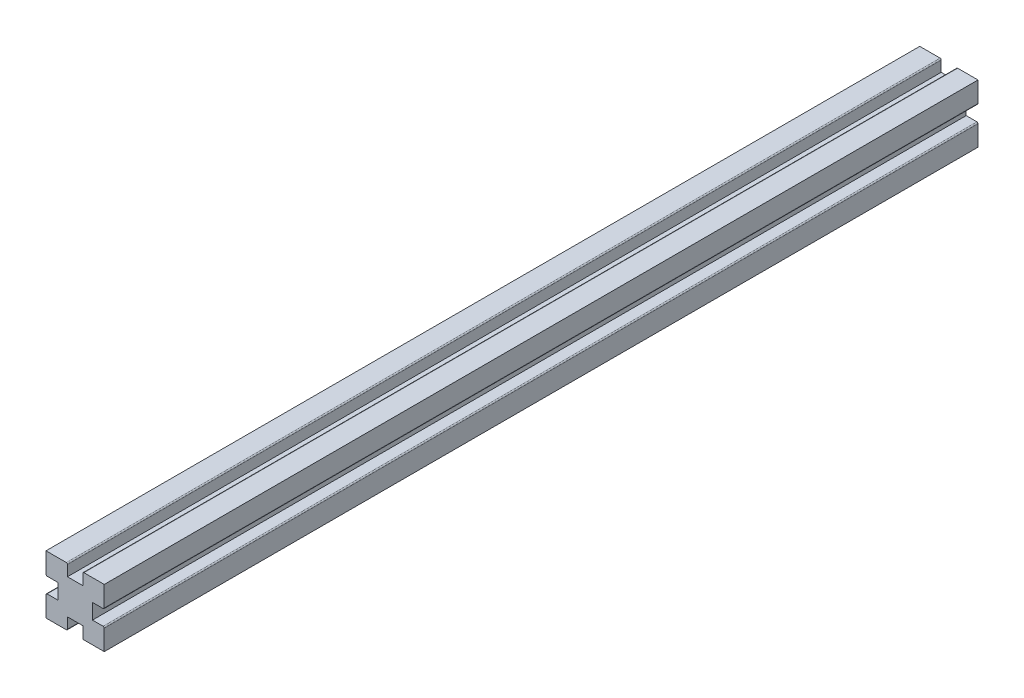
ISO-10303-21;
HEADER;
FILE_DESCRIPTION(('STEP AP214'),'2;1');
FILE_NAME('part.step','',(''),(''),'','','');
FILE_SCHEMA(('AUTOMOTIVE_DESIGN { 1 0 10303 214 1 1 1 1 }'));
ENDSEC;
DATA;
#1=APPLICATION_CONTEXT('core data for automotive mechanical design processes');
#2=APPLICATION_PROTOCOL_DEFINITION('international standard','automotive_design',2000,#1);
#3=PRODUCT_CONTEXT('',#1,'mechanical');
#4=PRODUCT('Part','Part','',(#3));
#5=PRODUCT_RELATED_PRODUCT_CATEGORY('part','',(#4));
#6=PRODUCT_DEFINITION_FORMATION('','',#4);
#7=PRODUCT_DEFINITION_CONTEXT('part definition',#1,'design');
#8=PRODUCT_DEFINITION('design','',#6,#7);
#9=PRODUCT_DEFINITION_SHAPE('','',#8);
#10=(LENGTH_UNIT() NAMED_UNIT(*) SI_UNIT(.MILLI.,.METRE.));
#11=(NAMED_UNIT(*) PLANE_ANGLE_UNIT() SI_UNIT($,.RADIAN.));
#12=(NAMED_UNIT(*) SI_UNIT($,.STERADIAN.) SOLID_ANGLE_UNIT());
#13=UNCERTAINTY_MEASURE_WITH_UNIT(LENGTH_MEASURE(1.E-05),#10,'distance_accuracy_value','');
#14=(GEOMETRIC_REPRESENTATION_CONTEXT(3) GLOBAL_UNCERTAINTY_ASSIGNED_CONTEXT((#13)) GLOBAL_UNIT_ASSIGNED_CONTEXT((#10,
#11,#12)) REPRESENTATION_CONTEXT('',''));
#15=CARTESIAN_POINT('',(0.,0.,0.));
#16=DIRECTION('',(0.,0.,1.));
#17=DIRECTION('',(1.,0.,0.));
#18=AXIS2_PLACEMENT_3D('',#15,#16,#17);
#19=CARTESIAN_POINT('',(-7.56816326530613,0.,381.));
#20=DIRECTION('',(-1.,0.,0.));
#21=DIRECTION('',(0.,-1.,0.));
#22=AXIS2_PLACEMENT_3D('',#19,#20,#21);
#23=PLANE('',#22);
#24=DIRECTION('',(0.,1.,0.));
#25=VECTOR('',#24,1.);
#26=CARTESIAN_POINT('',(-7.56816326530613,0.,0.));
#27=LINE('',#26,#25);
#28=CARTESIAN_POINT('',(-7.56816326530616,-3.33999999999992,0.));
#29=VERTEX_POINT('',#28);
#30=CARTESIAN_POINT('',(-7.56816326530609,3.34000000000008,0.));
#31=VERTEX_POINT('',#30);
#32=EDGE_CURVE('E242',#29,#31,#27,.T.);
#33=ORIENTED_EDGE('',*,*,#32,.F.);
#34=DIRECTION('',(0.,0.,-1.));
#35=VECTOR('',#34,1.);
#36=CARTESIAN_POINT('',(-7.56816326530616,-3.33999999999992,381.));
#37=LINE('',#36,#35);
#38=CARTESIAN_POINT('',(-7.56816326530616,-3.33999999999992,381.));
#39=VERTEX_POINT('',#38);
#40=EDGE_CURVE('E229',#39,#29,#37,.T.);
#41=ORIENTED_EDGE('',*,*,#40,.F.);
#42=DIRECTION('',(0.,1.,0.));
#43=VECTOR('',#42,1.);
#44=CARTESIAN_POINT('',(-7.56816326530613,0.,381.));
#45=LINE('',#44,#43);
#46=CARTESIAN_POINT('',(-7.56816326530609,3.34000000000008,381.));
#47=VERTEX_POINT('',#46);
#48=EDGE_CURVE('E236',#39,#47,#45,.T.);
#49=ORIENTED_EDGE('',*,*,#48,.T.);
#50=DIRECTION('',(0.,0.,-1.));
#51=VECTOR('',#50,1.);
#52=CARTESIAN_POINT('',(-7.56816326530609,3.34000000000008,381.));
#53=LINE('',#52,#51);
#54=EDGE_CURVE('E288',#47,#31,#53,.T.);
#55=ORIENTED_EDGE('',*,*,#54,.T.);
#56=EDGE_LOOP('',(#33,#41,#49,#55));
#57=FACE_BOUND('',#56,.T.);
#58=ADVANCED_FACE('F39',(#57),#23,.T.);
#59=CARTESIAN_POINT('',(0.,-3.34,381.));
#60=DIRECTION('',(0.,1.,0.));
#61=DIRECTION('',(-1.,0.,0.));
#62=AXIS2_PLACEMENT_3D('',#59,#60,#61);
#63=PLANE('',#62);
#64=DIRECTION('',(1.,0.,0.));
#65=VECTOR('',#64,1.);
#66=CARTESIAN_POINT('',(0.,-3.34,0.));
#67=LINE('',#66,#65);
#68=CARTESIAN_POINT('',(-12.2,-3.33999999999987,0.));
#69=VERTEX_POINT('',#68);
#70=EDGE_CURVE('E290',#69,#29,#67,.T.);
#71=ORIENTED_EDGE('',*,*,#70,.F.);
#72=DIRECTION('',(0.,0.,-1.));
#73=VECTOR('',#72,1.);
#74=CARTESIAN_POINT('',(-12.2,-3.33999999999987,381.));
#75=LINE('',#74,#73);
#76=CARTESIAN_POINT('',(-12.2,-3.33999999999987,381.));
#77=VERTEX_POINT('',#76);
#78=EDGE_CURVE('E232',#69,#77,#75,.F.);
#79=ORIENTED_EDGE('',*,*,#78,.T.);
#80=DIRECTION('',(1.,0.,0.));
#81=VECTOR('',#80,1.);
#82=CARTESIAN_POINT('',(0.,-3.34,381.));
#83=LINE('',#82,#81);
#84=EDGE_CURVE('E225',#77,#39,#83,.T.);
#85=ORIENTED_EDGE('',*,*,#84,.T.);
#86=ORIENTED_EDGE('',*,*,#40,.T.);
#87=EDGE_LOOP('',(#71,#79,#85,#86));
#88=FACE_BOUND('',#87,.T.);
#89=ADVANCED_FACE('F228',(#88),#63,.T.);
#90=CARTESIAN_POINT('',(-12.7,0.,381.));
#91=DIRECTION('',(1.,0.,0.));
#92=DIRECTION('',(0.,1.,0.));
#93=AXIS2_PLACEMENT_3D('',#90,#91,#92);
#94=PLANE('',#93);
#95=DIRECTION('',(0.,-1.,0.));
#96=VECTOR('',#95,1.);
#97=CARTESIAN_POINT('',(-12.7,0.,381.));
#98=LINE('',#97,#96);
#99=CARTESIAN_POINT('',(-12.7,-3.83999999999987,381.));
#100=VERTEX_POINT('',#99);
#101=CARTESIAN_POINT('',(-12.7,-12.7,381.));
#102=VERTEX_POINT('',#101);
#103=EDGE_CURVE('E235',#100,#102,#98,.T.);
#104=ORIENTED_EDGE('',*,*,#103,.F.);
#105=DIRECTION('',(0.,0.,-1.));
#106=VECTOR('',#105,1.);
#107=CARTESIAN_POINT('',(-12.7,-3.83999999999987,0.));
#108=LINE('',#107,#106);
#109=CARTESIAN_POINT('',(-12.7,-3.83999999999987,0.));
#110=VERTEX_POINT('',#109);
#111=EDGE_CURVE('E395',#100,#110,#108,.T.);
#112=ORIENTED_EDGE('',*,*,#111,.T.);
#113=DIRECTION('',(0.,-1.,0.));
#114=VECTOR('',#113,1.);
#115=CARTESIAN_POINT('',(-12.7,0.,0.));
#116=LINE('',#115,#114);
#117=CARTESIAN_POINT('',(-12.7,-12.7,0.));
#118=VERTEX_POINT('',#117);
#119=EDGE_CURVE('E292',#110,#118,#116,.T.);
#120=ORIENTED_EDGE('',*,*,#119,.T.);
#121=DIRECTION('',(0.,0.,-1.));
#122=VECTOR('',#121,1.);
#123=CARTESIAN_POINT('',(-12.7,-12.7,381.));
#124=LINE('',#123,#122);
#125=EDGE_CURVE('E244',#102,#118,#124,.T.);
#126=ORIENTED_EDGE('',*,*,#125,.F.);
#127=EDGE_LOOP('',(#104,#112,#120,#126));
#128=FACE_BOUND('',#127,.T.);
#129=ADVANCED_FACE('F512',(#128),#94,.F.);
#130=CARTESIAN_POINT('',(0.,-12.7,381.));
#131=DIRECTION('',(0.,1.,0.));
#132=DIRECTION('',(0.,0.,1.));
#133=AXIS2_PLACEMENT_3D('',#130,#131,#132);
#134=PLANE('',#133);
#135=DIRECTION('',(1.,0.,0.));
#136=VECTOR('',#135,1.);
#137=CARTESIAN_POINT('',(0.,-12.7,0.));
#138=LINE('',#137,#136);
#139=CARTESIAN_POINT('',(-3.83999999999981,-12.7,0.));
#140=VERTEX_POINT('',#139);
#141=EDGE_CURVE('E294',#118,#140,#138,.T.);
#142=ORIENTED_EDGE('',*,*,#141,.T.);
#143=DIRECTION('',(0.,0.,-1.));
#144=VECTOR('',#143,1.);
#145=CARTESIAN_POINT('',(-3.83999999999981,-12.7,381.));
#146=LINE('',#145,#144);
#147=CARTESIAN_POINT('',(-3.83999999999981,-12.7,381.));
#148=VERTEX_POINT('',#147);
#149=EDGE_CURVE('E373',#140,#148,#146,.F.);
#150=ORIENTED_EDGE('',*,*,#149,.T.);
#151=DIRECTION('',(1.,0.,0.));
#152=VECTOR('',#151,1.);
#153=CARTESIAN_POINT('',(0.,-12.7,381.));
#154=LINE('',#153,#152);
#155=EDGE_CURVE('E256',#102,#148,#154,.T.);
#156=ORIENTED_EDGE('',*,*,#155,.F.);
#157=ORIENTED_EDGE('',*,*,#125,.T.);
#158=EDGE_LOOP('',(#142,#150,#156,#157));
#159=FACE_BOUND('',#158,.T.);
#160=ADVANCED_FACE('F519',(#159),#134,.F.);
#161=CARTESIAN_POINT('',(-3.34000000000046,-1.7782157377853E-13,381.));
#162=DIRECTION('',(-1.,0.,0.));
#163=DIRECTION('',(0.,-1.,0.));
#164=AXIS2_PLACEMENT_3D('',#161,#162,#163);
#165=PLANE('',#164);
#166=DIRECTION('',(0.,1.,0.));
#167=VECTOR('',#166,1.);
#168=CARTESIAN_POINT('',(-3.34000000000046,-1.7782157377853E-13,381.));
#169=LINE('',#168,#167);
#170=CARTESIAN_POINT('',(-3.33999999999981,-12.2,381.));
#171=VERTEX_POINT('',#170);
#172=CARTESIAN_POINT('',(-3.34000000000005,-7.5681632653061,381.));
#173=VERTEX_POINT('',#172);
#174=EDGE_CURVE('E259',#171,#173,#169,.T.);
#175=ORIENTED_EDGE('',*,*,#174,.F.);
#176=DIRECTION('',(0.,0.,-1.));
#177=VECTOR('',#176,1.);
#178=CARTESIAN_POINT('',(-3.33999999999981,-12.2,381.));
#179=LINE('',#178,#177);
#180=CARTESIAN_POINT('',(-3.33999999999981,-12.2,0.));
#181=VERTEX_POINT('',#180);
#182=EDGE_CURVE('E243',#171,#181,#179,.T.);
#183=ORIENTED_EDGE('',*,*,#182,.T.);
#184=DIRECTION('',(0.,1.,0.));
#185=VECTOR('',#184,1.);
#186=CARTESIAN_POINT('',(-3.34000000000046,-1.7782157377853E-13,0.));
#187=LINE('',#186,#185);
#188=CARTESIAN_POINT('',(-3.34000000000005,-7.5681632653061,0.));
#189=VERTEX_POINT('',#188);
#190=EDGE_CURVE('E297',#181,#189,#187,.T.);
#191=ORIENTED_EDGE('',*,*,#190,.T.);
#192=DIRECTION('',(0.,0.,-1.));
#193=VECTOR('',#192,1.);
#194=CARTESIAN_POINT('',(-3.34000000000005,-7.5681632653061,381.));
#195=LINE('',#194,#193);
#196=EDGE_CURVE('E350',#173,#189,#195,.T.);
#197=ORIENTED_EDGE('',*,*,#196,.F.);
#198=EDGE_LOOP('',(#175,#183,#191,#197));
#199=FACE_BOUND('',#198,.T.);
#200=ADVANCED_FACE('F515',(#199),#165,.F.);
#201=CARTESIAN_POINT('',(0.,-7.56816326530607,381.));
#202=DIRECTION('',(0.,-1.,0.));
#203=DIRECTION('',(1.,0.,0.));
#204=AXIS2_PLACEMENT_3D('',#201,#202,#203);
#205=PLANE('',#204);
#206=DIRECTION('',(-1.,0.,0.));
#207=VECTOR('',#206,1.);
#208=CARTESIAN_POINT('',(0.,-7.56816326530607,0.));
#209=LINE('',#208,#207);
#210=CARTESIAN_POINT('',(3.34000000000022,-7.56816326530604,0.));
#211=VERTEX_POINT('',#210);
#212=EDGE_CURVE('E300',#211,#189,#209,.T.);
#213=ORIENTED_EDGE('',*,*,#212,.F.);
#214=DIRECTION('',(0.,0.,-1.));
#215=VECTOR('',#214,1.);
#216=CARTESIAN_POINT('',(3.34000000000022,-7.56816326530604,381.));
#217=LINE('',#216,#215);
#218=CARTESIAN_POINT('',(3.34000000000022,-7.56816326530604,381.));
#219=VERTEX_POINT('',#218);
#220=EDGE_CURVE('E347',#219,#211,#217,.T.);
#221=ORIENTED_EDGE('',*,*,#220,.F.);
#222=DIRECTION('',(-1.,0.,0.));
#223=VECTOR('',#222,1.);
#224=CARTESIAN_POINT('',(0.,-7.56816326530607,381.));
#225=LINE('',#224,#223);
#226=EDGE_CURVE('E262',#219,#173,#225,.T.);
#227=ORIENTED_EDGE('',*,*,#226,.T.);
#228=ORIENTED_EDGE('',*,*,#196,.T.);
#229=EDGE_LOOP('',(#213,#221,#227,#228));
#230=FACE_BOUND('',#229,.T.);
#231=ADVANCED_FACE('F518',(#230),#205,.T.);
#232=CARTESIAN_POINT('',(3.34000000000022,0.,381.));
#233=DIRECTION('',(-1.,0.,0.));
#234=DIRECTION('',(0.,-1.,0.));
#235=AXIS2_PLACEMENT_3D('',#232,#233,#234);
#236=PLANE('',#235);
#237=DIRECTION('',(0.,1.,0.));
#238=VECTOR('',#237,1.);
#239=CARTESIAN_POINT('',(3.34000000000022,0.,0.));
#240=LINE('',#239,#238);
#241=CARTESIAN_POINT('',(3.34000000000022,-12.2,0.));
#242=VERTEX_POINT('',#241);
#243=EDGE_CURVE('E303',#242,#211,#240,.T.);
#244=ORIENTED_EDGE('',*,*,#243,.F.);
#245=DIRECTION('',(0.,0.,-1.));
#246=VECTOR('',#245,1.);
#247=CARTESIAN_POINT('',(3.34000000000022,-12.2,381.));
#248=LINE('',#247,#246);
#249=CARTESIAN_POINT('',(3.34000000000022,-12.2,381.));
#250=VERTEX_POINT('',#249);
#251=EDGE_CURVE('E393',#242,#250,#248,.F.);
#252=ORIENTED_EDGE('',*,*,#251,.T.);
#253=DIRECTION('',(0.,1.,0.));
#254=VECTOR('',#253,1.);
#255=CARTESIAN_POINT('',(3.34000000000022,0.,381.));
#256=LINE('',#255,#254);
#257=EDGE_CURVE('E265',#250,#219,#256,.T.);
#258=ORIENTED_EDGE('',*,*,#257,.T.);
#259=ORIENTED_EDGE('',*,*,#220,.T.);
#260=EDGE_LOOP('',(#244,#252,#258,#259));
#261=FACE_BOUND('',#260,.T.);
#262=ADVANCED_FACE('F490',(#261),#236,.T.);
#263=CARTESIAN_POINT('',(3.84000000000022,-12.7,381.));
#264=VERTEX_POINT('',#263);
#265=CARTESIAN_POINT('',(12.7,-12.7,381.));
#266=VERTEX_POINT('',#265);
#267=EDGE_CURVE('E260',#264,#266,#154,.T.);
#268=ORIENTED_EDGE('',*,*,#267,.F.);
#269=DIRECTION('',(0.,0.,-1.));
#270=VECTOR('',#269,1.);
#271=CARTESIAN_POINT('',(3.84000000000022,-12.7,0.));
#272=LINE('',#271,#270);
#273=CARTESIAN_POINT('',(3.84000000000022,-12.7,0.));
#274=VERTEX_POINT('',#273);
#275=EDGE_CURVE('E390',#264,#274,#272,.T.);
#276=ORIENTED_EDGE('',*,*,#275,.T.);
#277=CARTESIAN_POINT('',(12.7,-12.7,0.));
#278=VERTEX_POINT('',#277);
#279=EDGE_CURVE('E298',#274,#278,#138,.T.);
#280=ORIENTED_EDGE('',*,*,#279,.T.);
#281=DIRECTION('',(0.,0.,-1.));
#282=VECTOR('',#281,1.);
#283=CARTESIAN_POINT('',(12.7,-12.7,381.));
#284=LINE('',#283,#282);
#285=EDGE_CURVE('E344',#266,#278,#284,.T.);
#286=ORIENTED_EDGE('',*,*,#285,.F.);
#287=EDGE_LOOP('',(#268,#276,#280,#286));
#288=FACE_BOUND('',#287,.T.);
#289=ADVANCED_FACE('F484',(#288),#134,.F.);
#290=CARTESIAN_POINT('',(12.7,0.,381.));
#291=DIRECTION('',(1.,0.,0.));
#292=DIRECTION('',(0.,0.,-1.));
#293=AXIS2_PLACEMENT_3D('',#290,#291,#292);
#294=PLANE('',#293);
#295=DIRECTION('',(0.,-1.,0.));
#296=VECTOR('',#295,1.);
#297=CARTESIAN_POINT('',(12.7,0.,0.));
#298=LINE('',#297,#296);
#299=CARTESIAN_POINT('',(12.7,-3.84000000000004,0.));
#300=VERTEX_POINT('',#299);
#301=EDGE_CURVE('E305',#300,#278,#298,.T.);
#302=ORIENTED_EDGE('',*,*,#301,.F.);
#303=DIRECTION('',(0.,0.,-1.));
#304=VECTOR('',#303,1.);
#305=CARTESIAN_POINT('',(12.7,-3.84000000000004,381.));
#306=LINE('',#305,#304);
#307=CARTESIAN_POINT('',(12.7,-3.84000000000004,381.));
#308=VERTEX_POINT('',#307);
#309=EDGE_CURVE('E411',#300,#308,#306,.F.);
#310=ORIENTED_EDGE('',*,*,#309,.T.);
#311=DIRECTION('',(0.,-1.,0.));
#312=VECTOR('',#311,1.);
#313=CARTESIAN_POINT('',(12.7,0.,381.));
#314=LINE('',#313,#312);
#315=EDGE_CURVE('E267',#308,#266,#314,.T.);
#316=ORIENTED_EDGE('',*,*,#315,.T.);
#317=ORIENTED_EDGE('',*,*,#285,.T.);
#318=EDGE_LOOP('',(#302,#310,#316,#317));
#319=FACE_BOUND('',#318,.T.);
#320=ADVANCED_FACE('F476',(#319),#294,.T.);
#321=CARTESIAN_POINT('',(0.,-3.34,381.));
#322=DIRECTION('',(0.,-1.,0.));
#323=DIRECTION('',(1.,0.,0.));
#324=AXIS2_PLACEMENT_3D('',#321,#322,#323);
#325=PLANE('',#324);
#326=DIRECTION('',(-1.,0.,0.));
#327=VECTOR('',#326,1.);
#328=CARTESIAN_POINT('',(0.,-3.34,381.));
#329=LINE('',#328,#327);
#330=CARTESIAN_POINT('',(12.2,-3.34000000000004,381.));
#331=VERTEX_POINT('',#330);
#332=CARTESIAN_POINT('',(7.56816326530612,-3.34000000000003,381.));
#333=VERTEX_POINT('',#332);
#334=EDGE_CURVE('E269',#331,#333,#329,.T.);
#335=ORIENTED_EDGE('',*,*,#334,.F.);
#336=DIRECTION('',(0.,0.,-1.));
#337=VECTOR('',#336,1.);
#338=CARTESIAN_POINT('',(12.2,-3.34000000000004,0.));
#339=LINE('',#338,#337);
#340=CARTESIAN_POINT('',(12.2,-3.34000000000004,0.));
#341=VERTEX_POINT('',#340);
#342=EDGE_CURVE('E408',#331,#341,#339,.T.);
#343=ORIENTED_EDGE('',*,*,#342,.T.);
#344=DIRECTION('',(-1.,0.,0.));
#345=VECTOR('',#344,1.);
#346=CARTESIAN_POINT('',(0.,-3.34,0.));
#347=LINE('',#346,#345);
#348=CARTESIAN_POINT('',(7.56816326530612,-3.34000000000003,0.));
#349=VERTEX_POINT('',#348);
#350=EDGE_CURVE('E308',#341,#349,#347,.T.);
#351=ORIENTED_EDGE('',*,*,#350,.T.);
#352=DIRECTION('',(0.,0.,-1.));
#353=VECTOR('',#352,1.);
#354=CARTESIAN_POINT('',(7.56816326530612,-3.34000000000003,381.));
#355=LINE('',#354,#353);
#356=EDGE_CURVE('E341',#333,#349,#355,.T.);
#357=ORIENTED_EDGE('',*,*,#356,.F.);
#358=EDGE_LOOP('',(#335,#343,#351,#357));
#359=FACE_BOUND('',#358,.T.);
#360=ADVANCED_FACE('F468',(#359),#325,.F.);
#361=CARTESIAN_POINT('',(7.56816326530613,0.,381.));
#362=DIRECTION('',(1.,0.,0.));
#363=DIRECTION('',(0.,1.,0.));
#364=AXIS2_PLACEMENT_3D('',#361,#362,#363);
#365=PLANE('',#364);
#366=DIRECTION('',(0.,-1.,0.));
#367=VECTOR('',#366,1.);
#368=CARTESIAN_POINT('',(7.56816326530613,0.,0.));
#369=LINE('',#368,#367);
#370=CARTESIAN_POINT('',(7.56816326530614,3.33999999999997,0.));
#371=VERTEX_POINT('',#370);
#372=EDGE_CURVE('E311',#371,#349,#369,.T.);
#373=ORIENTED_EDGE('',*,*,#372,.F.);
#374=DIRECTION('',(0.,0.,-1.));
#375=VECTOR('',#374,1.);
#376=CARTESIAN_POINT('',(7.56816326530614,3.33999999999997,381.));
#377=LINE('',#376,#375);
#378=CARTESIAN_POINT('',(7.56816326530614,3.33999999999997,381.));
#379=VERTEX_POINT('',#378);
#380=EDGE_CURVE('E338',#379,#371,#377,.T.);
#381=ORIENTED_EDGE('',*,*,#380,.F.);
#382=DIRECTION('',(0.,-1.,0.));
#383=VECTOR('',#382,1.);
#384=CARTESIAN_POINT('',(7.56816326530613,0.,381.));
#385=LINE('',#384,#383);
#386=EDGE_CURVE('E272',#379,#333,#385,.T.);
#387=ORIENTED_EDGE('',*,*,#386,.T.);
#388=ORIENTED_EDGE('',*,*,#356,.T.);
#389=EDGE_LOOP('',(#373,#381,#387,#388));
#390=FACE_BOUND('',#389,.T.);
#391=ADVANCED_FACE('F464',(#390),#365,.T.);
#392=CARTESIAN_POINT('',(0.,3.34,381.));
#393=DIRECTION('',(0.,-1.,0.));
#394=DIRECTION('',(1.,0.,0.));
#395=AXIS2_PLACEMENT_3D('',#392,#393,#394);
#396=PLANE('',#395);
#397=DIRECTION('',(-1.,0.,0.));
#398=VECTOR('',#397,1.);
#399=CARTESIAN_POINT('',(0.,3.34,0.));
#400=LINE('',#399,#398);
#401=CARTESIAN_POINT('',(12.2,3.33999999999996,0.));
#402=VERTEX_POINT('',#401);
#403=EDGE_CURVE('E314',#402,#371,#400,.T.);
#404=ORIENTED_EDGE('',*,*,#403,.F.);
#405=DIRECTION('',(0.,0.,-1.));
#406=VECTOR('',#405,1.);
#407=CARTESIAN_POINT('',(12.2,3.33999999999996,381.));
#408=LINE('',#407,#406);
#409=CARTESIAN_POINT('',(12.2,3.33999999999996,381.));
#410=VERTEX_POINT('',#409);
#411=EDGE_CURVE('E406',#402,#410,#408,.F.);
#412=ORIENTED_EDGE('',*,*,#411,.T.);
#413=DIRECTION('',(-1.,0.,0.));
#414=VECTOR('',#413,1.);
#415=CARTESIAN_POINT('',(0.,3.34,381.));
#416=LINE('',#415,#414);
#417=EDGE_CURVE('E275',#410,#379,#416,.T.);
#418=ORIENTED_EDGE('',*,*,#417,.T.);
#419=ORIENTED_EDGE('',*,*,#380,.T.);
#420=EDGE_LOOP('',(#404,#412,#418,#419));
#421=FACE_BOUND('',#420,.T.);
#422=ADVANCED_FACE('F457',(#421),#396,.T.);
#423=CARTESIAN_POINT('',(12.7,12.7,381.));
#424=VERTEX_POINT('',#423);
#425=CARTESIAN_POINT('',(12.7,3.83999999999996,381.));
#426=VERTEX_POINT('',#425);
#427=EDGE_CURVE('E270',#424,#426,#314,.T.);
#428=ORIENTED_EDGE('',*,*,#427,.T.);
#429=DIRECTION('',(0.,0.,-1.));
#430=VECTOR('',#429,1.);
#431=CARTESIAN_POINT('',(12.7,3.83999999999996,381.));
#432=LINE('',#431,#430);
#433=CARTESIAN_POINT('',(12.7,3.83999999999996,0.));
#434=VERTEX_POINT('',#433);
#435=EDGE_CURVE('E403',#426,#434,#432,.T.);
#436=ORIENTED_EDGE('',*,*,#435,.T.);
#437=CARTESIAN_POINT('',(12.7,12.7,0.));
#438=VERTEX_POINT('',#437);
#439=EDGE_CURVE('E309',#438,#434,#298,.T.);
#440=ORIENTED_EDGE('',*,*,#439,.F.);
#441=DIRECTION('',(0.,0.,-1.));
#442=VECTOR('',#441,1.);
#443=CARTESIAN_POINT('',(12.7,12.7,381.));
#444=LINE('',#443,#442);
#445=EDGE_CURVE('E335',#424,#438,#444,.T.);
#446=ORIENTED_EDGE('',*,*,#445,.F.);
#447=EDGE_LOOP('',(#428,#436,#440,#446));
#448=FACE_BOUND('',#447,.T.);
#449=ADVANCED_FACE('F449',(#448),#294,.T.);
#450=CARTESIAN_POINT('',(0.,12.7,381.));
#451=DIRECTION('',(0.,1.,0.));
#452=DIRECTION('',(0.,0.,1.));
#453=AXIS2_PLACEMENT_3D('',#450,#451,#452);
#454=PLANE('',#453);
#455=DIRECTION('',(1.,0.,0.));
#456=VECTOR('',#455,1.);
#457=CARTESIAN_POINT('',(0.,12.7,0.));
#458=LINE('',#457,#456);
#459=CARTESIAN_POINT('',(3.84,12.7,0.));
#460=VERTEX_POINT('',#459);
#461=EDGE_CURVE('E316',#460,#438,#458,.T.);
#462=ORIENTED_EDGE('',*,*,#461,.F.);
#463=DIRECTION('',(0.,0.,-1.));
#464=VECTOR('',#463,1.);
#465=CARTESIAN_POINT('',(3.84,12.7,381.));
#466=LINE('',#465,#464);
#467=CARTESIAN_POINT('',(3.84,12.7,381.));
#468=VERTEX_POINT('',#467);
#469=EDGE_CURVE('E11',#460,#468,#466,.F.);
#470=ORIENTED_EDGE('',*,*,#469,.T.);
#471=DIRECTION('',(1.,0.,0.));
#472=VECTOR('',#471,1.);
#473=CARTESIAN_POINT('',(0.,12.7,381.));
#474=LINE('',#473,#472);
#475=EDGE_CURVE('E277',#468,#424,#474,.T.);
#476=ORIENTED_EDGE('',*,*,#475,.T.);
#477=ORIENTED_EDGE('',*,*,#445,.T.);
#478=EDGE_LOOP('',(#462,#470,#476,#477));
#479=FACE_BOUND('',#478,.T.);
#480=ADVANCED_FACE('F442',(#479),#454,.T.);
#481=CARTESIAN_POINT('',(3.34,0.,381.));
#482=DIRECTION('',(1.,0.,0.));
#483=DIRECTION('',(0.,1.,0.));
#484=AXIS2_PLACEMENT_3D('',#481,#482,#483);
#485=PLANE('',#484);
#486=DIRECTION('',(0.,-1.,0.));
#487=VECTOR('',#486,1.);
#488=CARTESIAN_POINT('',(3.34,0.,381.));
#489=LINE('',#488,#487);
#490=CARTESIAN_POINT('',(3.34,12.2,381.));
#491=VERTEX_POINT('',#490);
#492=CARTESIAN_POINT('',(3.34,7.56816326530613,381.));
#493=VERTEX_POINT('',#492);
#494=EDGE_CURVE('E279',#491,#493,#489,.T.);
#495=ORIENTED_EDGE('',*,*,#494,.F.);
#496=DIRECTION('',(0.,0.,-1.));
#497=VECTOR('',#496,1.);
#498=CARTESIAN_POINT('',(3.34,12.2,0.));
#499=LINE('',#498,#497);
#500=CARTESIAN_POINT('',(3.34,12.2,0.));
#501=VERTEX_POINT('',#500);
#502=EDGE_CURVE('E47',#491,#501,#499,.T.);
#503=ORIENTED_EDGE('',*,*,#502,.T.);
#504=DIRECTION('',(0.,-1.,0.));
#505=VECTOR('',#504,1.);
#506=CARTESIAN_POINT('',(3.34,0.,0.));
#507=LINE('',#506,#505);
#508=CARTESIAN_POINT('',(3.34,7.56816326530613,0.));
#509=VERTEX_POINT('',#508);
#510=EDGE_CURVE('E318',#501,#509,#507,.T.);
#511=ORIENTED_EDGE('',*,*,#510,.T.);
#512=DIRECTION('',(0.,0.,-1.));
#513=VECTOR('',#512,1.);
#514=CARTESIAN_POINT('',(3.34,7.56816326530613,381.));
#515=LINE('',#514,#513);
#516=EDGE_CURVE('E332',#493,#509,#515,.T.);
#517=ORIENTED_EDGE('',*,*,#516,.F.);
#518=EDGE_LOOP('',(#495,#503,#511,#517));
#519=FACE_BOUND('',#518,.T.);
#520=ADVANCED_FACE('F422',(#519),#485,.F.);
#521=CARTESIAN_POINT('',(0.,7.56816326530613,381.));
#522=DIRECTION('',(0.,1.,0.));
#523=DIRECTION('',(-1.,0.,0.));
#524=AXIS2_PLACEMENT_3D('',#521,#522,#523);
#525=PLANE('',#524);
#526=DIRECTION('',(1.,0.,0.));
#527=VECTOR('',#526,1.);
#528=CARTESIAN_POINT('',(0.,7.56816326530613,0.));
#529=LINE('',#528,#527);
#530=CARTESIAN_POINT('',(-3.34,7.56816326530613,0.));
#531=VERTEX_POINT('',#530);
#532=EDGE_CURVE('E321',#531,#509,#529,.T.);
#533=ORIENTED_EDGE('',*,*,#532,.F.);
#534=DIRECTION('',(0.,0.,-1.));
#535=VECTOR('',#534,1.);
#536=CARTESIAN_POINT('',(-3.34,7.56816326530613,381.));
#537=LINE('',#536,#535);
#538=CARTESIAN_POINT('',(-3.34,7.56816326530613,381.));
#539=VERTEX_POINT('',#538);
#540=EDGE_CURVE('E329',#539,#531,#537,.T.);
#541=ORIENTED_EDGE('',*,*,#540,.F.);
#542=DIRECTION('',(1.,0.,0.));
#543=VECTOR('',#542,1.);
#544=CARTESIAN_POINT('',(0.,7.56816326530613,381.));
#545=LINE('',#544,#543);
#546=EDGE_CURVE('E282',#539,#493,#545,.T.);
#547=ORIENTED_EDGE('',*,*,#546,.T.);
#548=ORIENTED_EDGE('',*,*,#516,.T.);
#549=EDGE_LOOP('',(#533,#541,#547,#548));
#550=FACE_BOUND('',#549,.T.);
#551=ADVANCED_FACE('F434',(#550),#525,.T.);
#552=CARTESIAN_POINT('',(-3.34,0.,381.));
#553=DIRECTION('',(1.,0.,0.));
#554=DIRECTION('',(0.,1.,0.));
#555=AXIS2_PLACEMENT_3D('',#552,#553,#554);
#556=PLANE('',#555);
#557=DIRECTION('',(0.,-1.,0.));
#558=VECTOR('',#557,1.);
#559=CARTESIAN_POINT('',(-3.34,0.,0.));
#560=LINE('',#559,#558);
#561=CARTESIAN_POINT('',(-3.34,12.2,0.));
#562=VERTEX_POINT('',#561);
#563=EDGE_CURVE('E324',#562,#531,#560,.T.);
#564=ORIENTED_EDGE('',*,*,#563,.F.);
#565=DIRECTION('',(0.,0.,-1.));
#566=VECTOR('',#565,1.);
#567=CARTESIAN_POINT('',(-3.34,12.2,381.));
#568=LINE('',#567,#566);
#569=CARTESIAN_POINT('',(-3.34,12.2,381.));
#570=VERTEX_POINT('',#569);
#571=EDGE_CURVE('E416',#562,#570,#568,.F.);
#572=ORIENTED_EDGE('',*,*,#571,.T.);
#573=DIRECTION('',(0.,-1.,0.));
#574=VECTOR('',#573,1.);
#575=CARTESIAN_POINT('',(-3.34,0.,381.));
#576=LINE('',#575,#574);
#577=EDGE_CURVE('E285',#570,#539,#576,.T.);
#578=ORIENTED_EDGE('',*,*,#577,.T.);
#579=ORIENTED_EDGE('',*,*,#540,.T.);
#580=EDGE_LOOP('',(#564,#572,#578,#579));
#581=FACE_BOUND('',#580,.T.);
#582=ADVANCED_FACE('F540',(#581),#556,.T.);
#583=CARTESIAN_POINT('',(-12.7,12.7,381.));
#584=VERTEX_POINT('',#583);
#585=CARTESIAN_POINT('',(-3.84,12.7,381.));
#586=VERTEX_POINT('',#585);
#587=EDGE_CURVE('E280',#584,#586,#474,.T.);
#588=ORIENTED_EDGE('',*,*,#587,.T.);
#589=DIRECTION('',(0.,0.,-1.));
#590=VECTOR('',#589,1.);
#591=CARTESIAN_POINT('',(-3.84,12.7,381.));
#592=LINE('',#591,#590);
#593=CARTESIAN_POINT('',(-3.84,12.7,0.));
#594=VERTEX_POINT('',#593);
#595=EDGE_CURVE('E413',#586,#594,#592,.T.);
#596=ORIENTED_EDGE('',*,*,#595,.T.);
#597=CARTESIAN_POINT('',(-12.7,12.7,0.));
#598=VERTEX_POINT('',#597);
#599=EDGE_CURVE('E319',#598,#594,#458,.T.);
#600=ORIENTED_EDGE('',*,*,#599,.F.);
#601=DIRECTION('',(0.,0.,-1.));
#602=VECTOR('',#601,1.);
#603=CARTESIAN_POINT('',(-12.7,12.7,381.));
#604=LINE('',#603,#602);
#605=EDGE_CURVE('E327',#584,#598,#604,.T.);
#606=ORIENTED_EDGE('',*,*,#605,.F.);
#607=EDGE_LOOP('',(#588,#596,#600,#606));
#608=FACE_BOUND('',#607,.T.);
#609=ADVANCED_FACE('F543',(#608),#454,.T.);
#610=CARTESIAN_POINT('',(-12.7,3.84000000000013,0.));
#611=VERTEX_POINT('',#610);
#612=EDGE_CURVE('E252',#598,#611,#116,.T.);
#613=ORIENTED_EDGE('',*,*,#612,.T.);
#614=DIRECTION('',(0.,0.,-1.));
#615=VECTOR('',#614,1.);
#616=CARTESIAN_POINT('',(-12.7,3.84000000000013,381.));
#617=LINE('',#616,#615);
#618=CARTESIAN_POINT('',(-12.7,3.84000000000013,381.));
#619=VERTEX_POINT('',#618);
#620=EDGE_CURVE('E62',#611,#619,#617,.F.);
#621=ORIENTED_EDGE('',*,*,#620,.T.);
#622=EDGE_CURVE('E257',#584,#619,#98,.T.);
#623=ORIENTED_EDGE('',*,*,#622,.F.);
#624=ORIENTED_EDGE('',*,*,#605,.T.);
#625=EDGE_LOOP('',(#613,#621,#623,#624));
#626=FACE_BOUND('',#625,.T.);
#627=ADVANCED_FACE('F547',(#626),#94,.F.);
#628=CARTESIAN_POINT('',(0.,3.34,381.));
#629=DIRECTION('',(0.,1.,0.));
#630=DIRECTION('',(-1.,0.,0.));
#631=AXIS2_PLACEMENT_3D('',#628,#629,#630);
#632=PLANE('',#631);
#633=DIRECTION('',(1.,0.,0.));
#634=VECTOR('',#633,1.);
#635=CARTESIAN_POINT('',(0.,3.34,381.));
#636=LINE('',#635,#634);
#637=CARTESIAN_POINT('',(-12.2,3.34000000000013,381.));
#638=VERTEX_POINT('',#637);
#639=EDGE_CURVE('E248',#638,#47,#636,.T.);
#640=ORIENTED_EDGE('',*,*,#639,.F.);
#641=DIRECTION('',(0.,0.,-1.));
#642=VECTOR('',#641,1.);
#643=CARTESIAN_POINT('',(-12.2,3.34000000000013,381.));
#644=LINE('',#643,#642);
#645=CARTESIAN_POINT('',(-12.2,3.34000000000013,0.));
#646=VERTEX_POINT('',#645);
#647=EDGE_CURVE('E399',#638,#646,#644,.T.);
#648=ORIENTED_EDGE('',*,*,#647,.T.);
#649=DIRECTION('',(1.,0.,0.));
#650=VECTOR('',#649,1.);
#651=CARTESIAN_POINT('',(0.,3.34,0.));
#652=LINE('',#651,#650);
#653=EDGE_CURVE('E250',#646,#31,#652,.T.);
#654=ORIENTED_EDGE('',*,*,#653,.T.);
#655=ORIENTED_EDGE('',*,*,#54,.F.);
#656=EDGE_LOOP('',(#640,#648,#654,#655));
#657=FACE_BOUND('',#656,.T.);
#658=ADVANCED_FACE('F551',(#657),#632,.F.);
#659=CARTESIAN_POINT('',(0.,0.,381.));
#660=DIRECTION('',(0.,0.,1.));
#661=DIRECTION('',(1.,0.,0.));
#662=AXIS2_PLACEMENT_3D('',#659,#660,#661);
#663=PLANE('',#662);
#664=ORIENTED_EDGE('',*,*,#155,.T.);
#665=CARTESIAN_POINT('',(-3.83999999999981,-12.2,381.));
#666=DIRECTION('',(0.,0.,1.));
#667=DIRECTION('',(1.,0.,0.));
#668=AXIS2_PLACEMENT_3D('',#665,#666,#667);
#669=CIRCLE('',#668,0.5);
#670=EDGE_CURVE('E388',#148,#171,#669,.T.);
#671=ORIENTED_EDGE('',*,*,#670,.T.);
#672=ORIENTED_EDGE('',*,*,#174,.T.);
#673=ORIENTED_EDGE('',*,*,#226,.F.);
#674=ORIENTED_EDGE('',*,*,#257,.F.);
#675=CARTESIAN_POINT('',(3.84000000000022,-12.2,381.));
#676=DIRECTION('',(0.,0.,1.));
#677=DIRECTION('',(1.,0.,0.));
#678=AXIS2_PLACEMENT_3D('',#675,#676,#677);
#679=CIRCLE('',#678,0.5);
#680=EDGE_CURVE('E386',#250,#264,#679,.T.);
#681=ORIENTED_EDGE('',*,*,#680,.T.);
#682=ORIENTED_EDGE('',*,*,#267,.T.);
#683=ORIENTED_EDGE('',*,*,#315,.F.);
#684=CARTESIAN_POINT('',(12.2,-3.84000000000004,381.));
#685=DIRECTION('',(0.,0.,1.));
#686=DIRECTION('',(1.,0.,0.));
#687=AXIS2_PLACEMENT_3D('',#684,#685,#686);
#688=CIRCLE('',#687,0.5);
#689=EDGE_CURVE('E379',#308,#331,#688,.T.);
#690=ORIENTED_EDGE('',*,*,#689,.T.);
#691=ORIENTED_EDGE('',*,*,#334,.T.);
#692=ORIENTED_EDGE('',*,*,#386,.F.);
#693=ORIENTED_EDGE('',*,*,#417,.F.);
#694=CARTESIAN_POINT('',(12.2,3.83999999999996,381.));
#695=DIRECTION('',(0.,0.,1.));
#696=DIRECTION('',(1.,0.,0.));
#697=AXIS2_PLACEMENT_3D('',#694,#695,#696);
#698=CIRCLE('',#697,0.5);
#699=EDGE_CURVE('E381',#410,#426,#698,.T.);
#700=ORIENTED_EDGE('',*,*,#699,.T.);
#701=ORIENTED_EDGE('',*,*,#427,.F.);
#702=ORIENTED_EDGE('',*,*,#475,.F.);
#703=CARTESIAN_POINT('',(3.84,12.2,381.));
#704=DIRECTION('',(0.,0.,1.));
#705=DIRECTION('',(1.,0.,0.));
#706=AXIS2_PLACEMENT_3D('',#703,#704,#705);
#707=CIRCLE('',#706,0.5);
#708=EDGE_CURVE('E375',#468,#491,#707,.T.);
#709=ORIENTED_EDGE('',*,*,#708,.T.);
#710=ORIENTED_EDGE('',*,*,#494,.T.);
#711=ORIENTED_EDGE('',*,*,#546,.F.);
#712=ORIENTED_EDGE('',*,*,#577,.F.);
#713=CARTESIAN_POINT('',(-3.84,12.2,381.));
#714=DIRECTION('',(0.,0.,1.));
#715=DIRECTION('',(1.,0.,0.));
#716=AXIS2_PLACEMENT_3D('',#713,#714,#715);
#717=CIRCLE('',#716,0.5);
#718=EDGE_CURVE('E377',#570,#586,#717,.T.);
#719=ORIENTED_EDGE('',*,*,#718,.T.);
#720=ORIENTED_EDGE('',*,*,#587,.F.);
#721=ORIENTED_EDGE('',*,*,#622,.T.);
#722=CARTESIAN_POINT('',(-12.2,3.84000000000013,381.));
#723=DIRECTION('',(0.,0.,1.));
#724=DIRECTION('',(1.,0.,0.));
#725=AXIS2_PLACEMENT_3D('',#722,#723,#724);
#726=CIRCLE('',#725,0.5);
#727=EDGE_CURVE('E54',#619,#638,#726,.T.);
#728=ORIENTED_EDGE('',*,*,#727,.T.);
#729=ORIENTED_EDGE('',*,*,#639,.T.);
#730=ORIENTED_EDGE('',*,*,#48,.F.);
#731=ORIENTED_EDGE('',*,*,#84,.F.);
#732=CARTESIAN_POINT('',(-12.2,-3.83999999999987,381.));
#733=DIRECTION('',(0.,0.,1.));
#734=DIRECTION('',(1.,0.,0.));
#735=AXIS2_PLACEMENT_3D('',#732,#733,#734);
#736=CIRCLE('',#735,0.5);
#737=EDGE_CURVE('E384',#77,#100,#736,.T.);
#738=ORIENTED_EDGE('',*,*,#737,.T.);
#739=ORIENTED_EDGE('',*,*,#103,.T.);
#740=EDGE_LOOP('',(#664,#671,#672,#673,#674,#681,#682,#683,#690,#691,#692,#693,#700,#701,#702,
#709,#710,#711,#712,#719,#720,#721,#728,#729,#730,#731,#738,#739));
#741=FACE_BOUND('',#740,.T.);
#742=ADVANCED_FACE('F247',(#741),#663,.T.);
#743=CARTESIAN_POINT('',(0.,0.,0.));
#744=DIRECTION('',(0.,0.,1.));
#745=DIRECTION('',(1.,0.,0.));
#746=AXIS2_PLACEMENT_3D('',#743,#744,#745);
#747=PLANE('',#746);
#748=ORIENTED_EDGE('',*,*,#190,.F.);
#749=CARTESIAN_POINT('',(-3.83999999999981,-12.2,0.));
#750=DIRECTION('',(0.,0.,1.));
#751=DIRECTION('',(1.,0.,0.));
#752=AXIS2_PLACEMENT_3D('',#749,#750,#751);
#753=CIRCLE('',#752,0.5);
#754=EDGE_CURVE('E371',#181,#140,#753,.F.);
#755=ORIENTED_EDGE('',*,*,#754,.T.);
#756=ORIENTED_EDGE('',*,*,#141,.F.);
#757=ORIENTED_EDGE('',*,*,#119,.F.);
#758=CARTESIAN_POINT('',(-12.2,-3.83999999999987,0.));
#759=DIRECTION('',(0.,0.,1.));
#760=DIRECTION('',(1.,0.,0.));
#761=AXIS2_PLACEMENT_3D('',#758,#759,#760);
#762=CIRCLE('',#761,0.5);
#763=EDGE_CURVE('E367',#110,#69,#762,.F.);
#764=ORIENTED_EDGE('',*,*,#763,.T.);
#765=ORIENTED_EDGE('',*,*,#70,.T.);
#766=ORIENTED_EDGE('',*,*,#32,.T.);
#767=ORIENTED_EDGE('',*,*,#653,.F.);
#768=CARTESIAN_POINT('',(-12.2,3.84000000000013,0.));
#769=DIRECTION('',(0.,0.,1.));
#770=DIRECTION('',(1.,0.,0.));
#771=AXIS2_PLACEMENT_3D('',#768,#769,#770);
#772=CIRCLE('',#771,0.5);
#773=EDGE_CURVE('E365',#646,#611,#772,.F.);
#774=ORIENTED_EDGE('',*,*,#773,.T.);
#775=ORIENTED_EDGE('',*,*,#612,.F.);
#776=ORIENTED_EDGE('',*,*,#599,.T.);
#777=CARTESIAN_POINT('',(-3.84,12.2,0.));
#778=DIRECTION('',(0.,0.,1.));
#779=DIRECTION('',(1.,0.,0.));
#780=AXIS2_PLACEMENT_3D('',#777,#778,#779);
#781=CIRCLE('',#780,0.5);
#782=EDGE_CURVE('E359',#594,#562,#781,.F.);
#783=ORIENTED_EDGE('',*,*,#782,.T.);
#784=ORIENTED_EDGE('',*,*,#563,.T.);
#785=ORIENTED_EDGE('',*,*,#532,.T.);
#786=ORIENTED_EDGE('',*,*,#510,.F.);
#787=CARTESIAN_POINT('',(3.84,12.2,0.));
#788=DIRECTION('',(0.,0.,1.));
#789=DIRECTION('',(1.,0.,0.));
#790=AXIS2_PLACEMENT_3D('',#787,#788,#789);
#791=CIRCLE('',#790,0.5);
#792=EDGE_CURVE('E357',#501,#460,#791,.F.);
#793=ORIENTED_EDGE('',*,*,#792,.T.);
#794=ORIENTED_EDGE('',*,*,#461,.T.);
#795=ORIENTED_EDGE('',*,*,#439,.T.);
#796=CARTESIAN_POINT('',(12.2,3.83999999999996,0.));
#797=DIRECTION('',(0.,0.,1.));
#798=DIRECTION('',(1.,0.,0.));
#799=AXIS2_PLACEMENT_3D('',#796,#797,#798);
#800=CIRCLE('',#799,0.5);
#801=EDGE_CURVE('E363',#434,#402,#800,.F.);
#802=ORIENTED_EDGE('',*,*,#801,.T.);
#803=ORIENTED_EDGE('',*,*,#403,.T.);
#804=ORIENTED_EDGE('',*,*,#372,.T.);
#805=ORIENTED_EDGE('',*,*,#350,.F.);
#806=CARTESIAN_POINT('',(12.2,-3.84000000000004,0.));
#807=DIRECTION('',(0.,0.,1.));
#808=DIRECTION('',(1.,0.,0.));
#809=AXIS2_PLACEMENT_3D('',#806,#807,#808);
#810=CIRCLE('',#809,0.5);
#811=EDGE_CURVE('E361',#341,#300,#810,.F.);
#812=ORIENTED_EDGE('',*,*,#811,.T.);
#813=ORIENTED_EDGE('',*,*,#301,.T.);
#814=ORIENTED_EDGE('',*,*,#279,.F.);
#815=CARTESIAN_POINT('',(3.84000000000022,-12.2,0.));
#816=DIRECTION('',(0.,0.,1.));
#817=DIRECTION('',(1.,0.,0.));
#818=AXIS2_PLACEMENT_3D('',#815,#816,#817);
#819=CIRCLE('',#818,0.5);
#820=EDGE_CURVE('E369',#274,#242,#819,.F.);
#821=ORIENTED_EDGE('',*,*,#820,.T.);
#822=ORIENTED_EDGE('',*,*,#243,.T.);
#823=ORIENTED_EDGE('',*,*,#212,.T.);
#824=EDGE_LOOP('',(#748,#755,#756,#757,#764,#765,#766,#767,#774,#775,#776,#783,#784,#785,#786,
#793,#794,#795,#802,#803,#804,#805,#812,#813,#814,#821,#822,#823));
#825=FACE_BOUND('',#824,.T.);
#826=ADVANCED_FACE('F428',(#825),#747,.F.);
#827=CARTESIAN_POINT('',(-3.83999999999981,-12.2,381.));
#828=DIRECTION('',(0.,0.,-1.));
#829=DIRECTION('',(-1.,0.,0.));
#830=AXIS2_PLACEMENT_3D('',#827,#828,#829);
#831=CYLINDRICAL_SURFACE('',#830,0.5);
#832=ORIENTED_EDGE('',*,*,#670,.F.);
#833=ORIENTED_EDGE('',*,*,#149,.F.);
#834=ORIENTED_EDGE('',*,*,#754,.F.);
#835=ORIENTED_EDGE('',*,*,#182,.F.);
#836=EDGE_LOOP('',(#832,#833,#834,#835));
#837=FACE_BOUND('',#836,.T.);
#838=ADVANCED_FACE('F496',(#837),#831,.T.);
#839=CARTESIAN_POINT('',(3.84000000000022,-12.2,381.));
#840=DIRECTION('',(0.,0.,1.));
#841=DIRECTION('',(1.,0.,0.));
#842=AXIS2_PLACEMENT_3D('',#839,#840,#841);
#843=CYLINDRICAL_SURFACE('',#842,0.5);
#844=ORIENTED_EDGE('',*,*,#680,.F.);
#845=ORIENTED_EDGE('',*,*,#251,.F.);
#846=ORIENTED_EDGE('',*,*,#820,.F.);
#847=ORIENTED_EDGE('',*,*,#275,.F.);
#848=EDGE_LOOP('',(#844,#845,#846,#847));
#849=FACE_BOUND('',#848,.T.);
#850=ADVANCED_FACE('F493',(#849),#843,.T.);
#851=CARTESIAN_POINT('',(-12.2,-3.83999999999987,381.));
#852=DIRECTION('',(0.,0.,1.));
#853=DIRECTION('',(1.,0.,0.));
#854=AXIS2_PLACEMENT_3D('',#851,#852,#853);
#855=CYLINDRICAL_SURFACE('',#854,0.5);
#856=ORIENTED_EDGE('',*,*,#737,.F.);
#857=ORIENTED_EDGE('',*,*,#78,.F.);
#858=ORIENTED_EDGE('',*,*,#763,.F.);
#859=ORIENTED_EDGE('',*,*,#111,.F.);
#860=EDGE_LOOP('',(#856,#857,#858,#859));
#861=FACE_BOUND('',#860,.T.);
#862=ADVANCED_FACE('F495',(#861),#855,.T.);
#863=CARTESIAN_POINT('',(-12.2,3.84000000000013,381.));
#864=DIRECTION('',(0.,0.,-1.));
#865=DIRECTION('',(-1.,0.,0.));
#866=AXIS2_PLACEMENT_3D('',#863,#864,#865);
#867=CYLINDRICAL_SURFACE('',#866,0.5);
#868=ORIENTED_EDGE('',*,*,#727,.F.);
#869=ORIENTED_EDGE('',*,*,#620,.F.);
#870=ORIENTED_EDGE('',*,*,#773,.F.);
#871=ORIENTED_EDGE('',*,*,#647,.F.);
#872=EDGE_LOOP('',(#868,#869,#870,#871));
#873=FACE_BOUND('',#872,.T.);
#874=ADVANCED_FACE('F502',(#873),#867,.T.);
#875=CARTESIAN_POINT('',(12.2,3.83999999999996,381.));
#876=DIRECTION('',(0.,0.,-1.));
#877=DIRECTION('',(-1.,0.,0.));
#878=AXIS2_PLACEMENT_3D('',#875,#876,#877);
#879=CYLINDRICAL_SURFACE('',#878,0.5);
#880=ORIENTED_EDGE('',*,*,#699,.F.);
#881=ORIENTED_EDGE('',*,*,#411,.F.);
#882=ORIENTED_EDGE('',*,*,#801,.F.);
#883=ORIENTED_EDGE('',*,*,#435,.F.);
#884=EDGE_LOOP('',(#880,#881,#882,#883));
#885=FACE_BOUND('',#884,.T.);
#886=ADVANCED_FACE('F453',(#885),#879,.T.);
#887=CARTESIAN_POINT('',(12.2,-3.84000000000004,381.));
#888=DIRECTION('',(0.,0.,1.));
#889=DIRECTION('',(1.,0.,0.));
#890=AXIS2_PLACEMENT_3D('',#887,#888,#889);
#891=CYLINDRICAL_SURFACE('',#890,0.5);
#892=ORIENTED_EDGE('',*,*,#689,.F.);
#893=ORIENTED_EDGE('',*,*,#309,.F.);
#894=ORIENTED_EDGE('',*,*,#811,.F.);
#895=ORIENTED_EDGE('',*,*,#342,.F.);
#896=EDGE_LOOP('',(#892,#893,#894,#895));
#897=FACE_BOUND('',#896,.T.);
#898=ADVANCED_FACE('F472',(#897),#891,.T.);
#899=CARTESIAN_POINT('',(-3.84,12.2,381.));
#900=DIRECTION('',(0.,0.,-1.));
#901=DIRECTION('',(-1.,0.,0.));
#902=AXIS2_PLACEMENT_3D('',#899,#900,#901);
#903=CYLINDRICAL_SURFACE('',#902,0.5);
#904=ORIENTED_EDGE('',*,*,#718,.F.);
#905=ORIENTED_EDGE('',*,*,#571,.F.);
#906=ORIENTED_EDGE('',*,*,#782,.F.);
#907=ORIENTED_EDGE('',*,*,#595,.F.);
#908=EDGE_LOOP('',(#904,#905,#906,#907));
#909=FACE_BOUND('',#908,.T.);
#910=ADVANCED_FACE('F611',(#909),#903,.T.);
#911=CARTESIAN_POINT('',(3.84,12.2,381.));
#912=DIRECTION('',(0.,0.,1.));
#913=DIRECTION('',(1.,0.,0.));
#914=AXIS2_PLACEMENT_3D('',#911,#912,#913);
#915=CYLINDRICAL_SURFACE('',#914,0.5);
#916=ORIENTED_EDGE('',*,*,#708,.F.);
#917=ORIENTED_EDGE('',*,*,#469,.F.);
#918=ORIENTED_EDGE('',*,*,#792,.F.);
#919=ORIENTED_EDGE('',*,*,#502,.F.);
#920=EDGE_LOOP('',(#916,#917,#918,#919));
#921=FACE_BOUND('',#920,.T.);
#922=ADVANCED_FACE('F41',(#921),#915,.T.);
#923=CLOSED_SHELL('',(#58,#89,#129,#160,#200,#231,#262,#289,#320,#360,#391,#422,#449,#480,#520,
#551,#582,#609,#627,#658,#742,#826,#838,#850,#862,#874,#886,#898,#910,#922));
#924=MANIFOLD_SOLID_BREP('B2',#923);
#925=ADVANCED_BREP_SHAPE_REPRESENTATION('',(#18,#924),#14);
#926=SHAPE_DEFINITION_REPRESENTATION(#9,#925);
ENDSEC;
END-ISO-10303-21;
